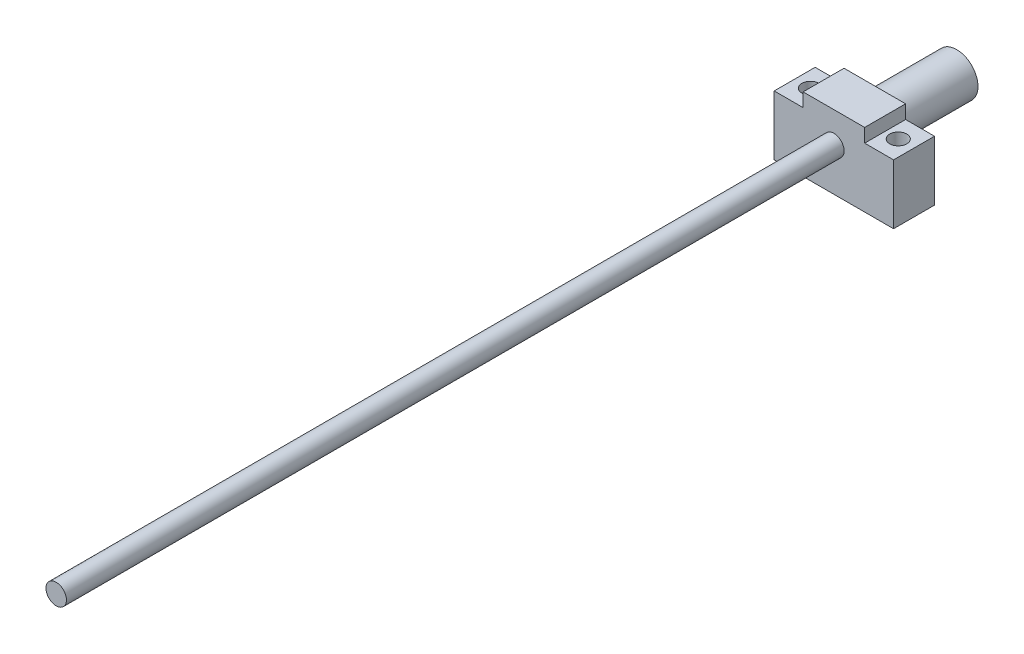
ISO-10303-21;
HEADER;
FILE_DESCRIPTION(('STEP AP214'),'2;1');
FILE_NAME('part.step','',(''),(''),'','','');
FILE_SCHEMA(('AUTOMOTIVE_DESIGN { 1 0 10303 214 1 1 1 1 }'));
ENDSEC;
DATA;
#1=APPLICATION_CONTEXT('core data for automotive mechanical design processes');
#2=APPLICATION_PROTOCOL_DEFINITION('international standard','automotive_design',2000,#1);
#3=PRODUCT_CONTEXT('',#1,'mechanical');
#4=PRODUCT('Part','Part','',(#3));
#5=PRODUCT_RELATED_PRODUCT_CATEGORY('part','',(#4));
#6=PRODUCT_DEFINITION_FORMATION('','',#4);
#7=PRODUCT_DEFINITION_CONTEXT('part definition',#1,'design');
#8=PRODUCT_DEFINITION('design','',#6,#7);
#9=PRODUCT_DEFINITION_SHAPE('','',#8);
#10=(LENGTH_UNIT() NAMED_UNIT(*) SI_UNIT(.MILLI.,.METRE.));
#11=(NAMED_UNIT(*) PLANE_ANGLE_UNIT() SI_UNIT($,.RADIAN.));
#12=(NAMED_UNIT(*) SI_UNIT($,.STERADIAN.) SOLID_ANGLE_UNIT());
#13=UNCERTAINTY_MEASURE_WITH_UNIT(LENGTH_MEASURE(1.E-05),#10,'distance_accuracy_value','');
#14=(GEOMETRIC_REPRESENTATION_CONTEXT(3) GLOBAL_UNCERTAINTY_ASSIGNED_CONTEXT((#13)) GLOBAL_UNIT_ASSIGNED_CONTEXT((#10,
#11,#12)) REPRESENTATION_CONTEXT('',''));
#15=CARTESIAN_POINT('',(0.,0.,0.));
#16=DIRECTION('',(0.,0.,1.));
#17=DIRECTION('',(1.,0.,0.));
#18=AXIS2_PLACEMENT_3D('',#15,#16,#17);
#19=CARTESIAN_POINT('',(18.05,0.,24.));
#20=DIRECTION('',(-1.,0.,0.));
#21=DIRECTION('',(0.,-1.,0.));
#22=AXIS2_PLACEMENT_3D('',#19,#20,#21);
#23=PLANE('',#22);
#24=DIRECTION('',(0.,1.,0.));
#25=VECTOR('',#24,1.);
#26=CARTESIAN_POINT('',(18.05,0.,0.));
#27=LINE('',#26,#25);
#28=CARTESIAN_POINT('',(18.05,17.5,0.));
#29=VERTEX_POINT('',#28);
#30=CARTESIAN_POINT('',(18.05,25.5,0.));
#31=VERTEX_POINT('',#30);
#32=EDGE_CURVE('E143',#29,#31,#27,.T.);
#33=ORIENTED_EDGE('',*,*,#32,.T.);
#34=DIRECTION('',(0.,0.,-1.));
#35=VECTOR('',#34,1.);
#36=CARTESIAN_POINT('',(18.05,25.5,24.));
#37=LINE('',#36,#35);
#38=CARTESIAN_POINT('',(18.05,25.5,24.));
#39=VERTEX_POINT('',#38);
#40=EDGE_CURVE('E11',#39,#31,#37,.T.);
#41=ORIENTED_EDGE('',*,*,#40,.F.);
#42=DIRECTION('',(0.,1.,0.));
#43=VECTOR('',#42,1.);
#44=CARTESIAN_POINT('',(18.05,0.,24.));
#45=LINE('',#44,#43);
#46=CARTESIAN_POINT('',(18.05,17.5,24.));
#47=VERTEX_POINT('',#46);
#48=EDGE_CURVE('E190',#47,#39,#45,.T.);
#49=ORIENTED_EDGE('',*,*,#48,.F.);
#50=DIRECTION('',(0.,0.,-1.));
#51=VECTOR('',#50,1.);
#52=CARTESIAN_POINT('',(18.05,17.5,24.));
#53=LINE('',#52,#51);
#54=EDGE_CURVE('E139',#47,#29,#53,.T.);
#55=ORIENTED_EDGE('',*,*,#54,.T.);
#56=EDGE_LOOP('',(#33,#41,#49,#55));
#57=FACE_BOUND('',#56,.T.);
#58=ADVANCED_FACE('F47',(#57),#23,.F.);
#59=CARTESIAN_POINT('',(0.,25.5,24.));
#60=DIRECTION('',(0.,-1.,0.));
#61=DIRECTION('',(0.,0.,-1.));
#62=AXIS2_PLACEMENT_3D('',#59,#60,#61);
#63=PLANE('',#62);
#64=DIRECTION('',(-1.,0.,0.));
#65=VECTOR('',#64,1.);
#66=CARTESIAN_POINT('',(0.,25.5,0.));
#67=LINE('',#66,#65);
#68=CARTESIAN_POINT('',(-18.05,25.5,0.));
#69=VERTEX_POINT('',#68);
#70=EDGE_CURVE('E146',#31,#69,#67,.T.);
#71=ORIENTED_EDGE('',*,*,#70,.T.);
#72=DIRECTION('',(0.,0.,-1.));
#73=VECTOR('',#72,1.);
#74=CARTESIAN_POINT('',(-18.05,25.5,24.));
#75=LINE('',#74,#73);
#76=CARTESIAN_POINT('',(-18.05,25.5,24.));
#77=VERTEX_POINT('',#76);
#78=EDGE_CURVE('E55',#77,#69,#75,.T.);
#79=ORIENTED_EDGE('',*,*,#78,.F.);
#80=DIRECTION('',(-1.,0.,0.));
#81=VECTOR('',#80,1.);
#82=CARTESIAN_POINT('',(0.,25.5,24.));
#83=LINE('',#82,#81);
#84=EDGE_CURVE('E106',#39,#77,#83,.T.);
#85=ORIENTED_EDGE('',*,*,#84,.F.);
#86=ORIENTED_EDGE('',*,*,#40,.T.);
#87=EDGE_LOOP('',(#71,#79,#85,#86));
#88=FACE_BOUND('',#87,.T.);
#89=ADVANCED_FACE('F259',(#88),#63,.F.);
#90=CARTESIAN_POINT('',(-18.05,0.,24.));
#91=DIRECTION('',(1.,0.,0.));
#92=DIRECTION('',(0.,0.,-1.));
#93=AXIS2_PLACEMENT_3D('',#90,#91,#92);
#94=PLANE('',#93);
#95=DIRECTION('',(0.,-1.,0.));
#96=VECTOR('',#95,1.);
#97=CARTESIAN_POINT('',(-18.05,0.,0.));
#98=LINE('',#97,#96);
#99=CARTESIAN_POINT('',(-18.05,17.5,0.));
#100=VERTEX_POINT('',#99);
#101=EDGE_CURVE('E149',#69,#100,#98,.T.);
#102=ORIENTED_EDGE('',*,*,#101,.T.);
#103=DIRECTION('',(0.,0.,-1.));
#104=VECTOR('',#103,1.);
#105=CARTESIAN_POINT('',(-18.05,17.5,24.));
#106=LINE('',#105,#104);
#107=CARTESIAN_POINT('',(-18.05,17.5,24.));
#108=VERTEX_POINT('',#107);
#109=EDGE_CURVE('E165',#108,#100,#106,.T.);
#110=ORIENTED_EDGE('',*,*,#109,.F.);
#111=DIRECTION('',(0.,-1.,0.));
#112=VECTOR('',#111,1.);
#113=CARTESIAN_POINT('',(-18.05,0.,24.));
#114=LINE('',#113,#112);
#115=EDGE_CURVE('E173',#77,#108,#114,.T.);
#116=ORIENTED_EDGE('',*,*,#115,.F.);
#117=ORIENTED_EDGE('',*,*,#78,.T.);
#118=EDGE_LOOP('',(#102,#110,#116,#117));
#119=FACE_BOUND('',#118,.T.);
#120=ADVANCED_FACE('F171',(#119),#94,.F.);
#121=CARTESIAN_POINT('',(0.,17.5,24.));
#122=DIRECTION('',(0.,-1.,0.));
#123=DIRECTION('',(0.,0.,-1.));
#124=AXIS2_PLACEMENT_3D('',#121,#122,#123);
#125=PLANE('',#124);
#126=CARTESIAN_POINT('',(-25.75,17.5000000000001,12.));
#127=DIRECTION('',(0.,1.,0.));
#128=DIRECTION('',(0.,0.,1.));
#129=AXIS2_PLACEMENT_3D('',#126,#127,#128);
#130=CIRCLE('',#129,4.99999999999999);
#131=CARTESIAN_POINT('',(-25.75,17.5000000000001,17.));
#132=VERTEX_POINT('',#131);
#133=EDGE_CURVE('E211',#132,#132,#130,.T.);
#134=ORIENTED_EDGE('',*,*,#133,.F.);
#135=EDGE_LOOP('',(#134));
#136=FACE_BOUND('',#135,.T.);
#137=DIRECTION('',(-1.,0.,0.));
#138=VECTOR('',#137,1.);
#139=CARTESIAN_POINT('',(0.,17.5,0.));
#140=LINE('',#139,#138);
#141=CARTESIAN_POINT('',(-35.,17.5,0.));
#142=VERTEX_POINT('',#141);
#143=EDGE_CURVE('E151',#100,#142,#140,.T.);
#144=ORIENTED_EDGE('',*,*,#143,.T.);
#145=DIRECTION('',(0.,0.,-1.));
#146=VECTOR('',#145,1.);
#147=CARTESIAN_POINT('',(-35.,17.5,24.));
#148=LINE('',#147,#146);
#149=CARTESIAN_POINT('',(-35.,17.5,24.));
#150=VERTEX_POINT('',#149);
#151=EDGE_CURVE('E162',#150,#142,#148,.T.);
#152=ORIENTED_EDGE('',*,*,#151,.F.);
#153=DIRECTION('',(-1.,0.,0.));
#154=VECTOR('',#153,1.);
#155=CARTESIAN_POINT('',(0.,17.5,24.));
#156=LINE('',#155,#154);
#157=EDGE_CURVE('E185',#108,#150,#156,.T.);
#158=ORIENTED_EDGE('',*,*,#157,.F.);
#159=ORIENTED_EDGE('',*,*,#109,.T.);
#160=EDGE_LOOP('',(#144,#152,#158,#159));
#161=FACE_BOUND('',#160,.T.);
#162=ADVANCED_FACE('F181',(#136,#161),#125,.F.);
#163=CARTESIAN_POINT('',(-35.,0.,24.));
#164=DIRECTION('',(1.,0.,0.));
#165=DIRECTION('',(0.,0.,-1.));
#166=AXIS2_PLACEMENT_3D('',#163,#164,#165);
#167=PLANE('',#166);
#168=DIRECTION('',(0.,-1.,0.));
#169=VECTOR('',#168,1.);
#170=CARTESIAN_POINT('',(-35.,0.,0.));
#171=LINE('',#170,#169);
#172=CARTESIAN_POINT('',(-35.,-17.5,0.));
#173=VERTEX_POINT('',#172);
#174=EDGE_CURVE('E153',#142,#173,#171,.T.);
#175=ORIENTED_EDGE('',*,*,#174,.T.);
#176=DIRECTION('',(0.,0.,-1.));
#177=VECTOR('',#176,1.);
#178=CARTESIAN_POINT('',(-35.,-17.5,24.));
#179=LINE('',#178,#177);
#180=CARTESIAN_POINT('',(-35.,-17.5,24.));
#181=VERTEX_POINT('',#180);
#182=EDGE_CURVE('E134',#181,#173,#179,.T.);
#183=ORIENTED_EDGE('',*,*,#182,.F.);
#184=DIRECTION('',(0.,-1.,0.));
#185=VECTOR('',#184,1.);
#186=CARTESIAN_POINT('',(-35.,0.,24.));
#187=LINE('',#186,#185);
#188=EDGE_CURVE('E125',#150,#181,#187,.T.);
#189=ORIENTED_EDGE('',*,*,#188,.F.);
#190=ORIENTED_EDGE('',*,*,#151,.T.);
#191=EDGE_LOOP('',(#175,#183,#189,#190));
#192=FACE_BOUND('',#191,.T.);
#193=ADVANCED_FACE('F184',(#192),#167,.F.);
#194=CARTESIAN_POINT('',(0.,-17.5,24.));
#195=DIRECTION('',(0.,1.,0.));
#196=DIRECTION('',(0.,0.,1.));
#197=AXIS2_PLACEMENT_3D('',#194,#195,#196);
#198=PLANE('',#197);
#199=CARTESIAN_POINT('',(-25.75,-17.5,12.));
#200=DIRECTION('',(0.,1.,0.));
#201=DIRECTION('',(0.,0.,1.));
#202=AXIS2_PLACEMENT_3D('',#199,#200,#201);
#203=CIRCLE('',#202,4.99999999999999);
#204=CARTESIAN_POINT('',(-25.75,-17.5,17.));
#205=VERTEX_POINT('',#204);
#206=EDGE_CURVE('E208',#205,#205,#203,.T.);
#207=ORIENTED_EDGE('',*,*,#206,.T.);
#208=EDGE_LOOP('',(#207));
#209=FACE_BOUND('',#208,.T.);
#210=CARTESIAN_POINT('',(25.75,-17.5000000000001,12.));
#211=DIRECTION('',(0.,1.,0.));
#212=DIRECTION('',(0.,0.,1.));
#213=AXIS2_PLACEMENT_3D('',#210,#211,#212);
#214=CIRCLE('',#213,4.99999999999999);
#215=CARTESIAN_POINT('',(25.75,-17.5000000000001,17.));
#216=VERTEX_POINT('',#215);
#217=EDGE_CURVE('E200',#216,#216,#214,.T.);
#218=ORIENTED_EDGE('',*,*,#217,.T.);
#219=EDGE_LOOP('',(#218));
#220=FACE_BOUND('',#219,.T.);
#221=DIRECTION('',(1.,0.,0.));
#222=VECTOR('',#221,1.);
#223=CARTESIAN_POINT('',(0.,-17.5,0.));
#224=LINE('',#223,#222);
#225=CARTESIAN_POINT('',(35.,-17.5,0.));
#226=VERTEX_POINT('',#225);
#227=EDGE_CURVE('E133',#173,#226,#224,.T.);
#228=ORIENTED_EDGE('',*,*,#227,.T.);
#229=DIRECTION('',(0.,0.,-1.));
#230=VECTOR('',#229,1.);
#231=CARTESIAN_POINT('',(35.,-17.5,24.));
#232=LINE('',#231,#230);
#233=CARTESIAN_POINT('',(35.,-17.5,24.));
#234=VERTEX_POINT('',#233);
#235=EDGE_CURVE('E130',#234,#226,#232,.T.);
#236=ORIENTED_EDGE('',*,*,#235,.F.);
#237=DIRECTION('',(1.,0.,0.));
#238=VECTOR('',#237,1.);
#239=CARTESIAN_POINT('',(0.,-17.5,24.));
#240=LINE('',#239,#238);
#241=EDGE_CURVE('E119',#181,#234,#240,.T.);
#242=ORIENTED_EDGE('',*,*,#241,.F.);
#243=ORIENTED_EDGE('',*,*,#182,.T.);
#244=EDGE_LOOP('',(#228,#236,#242,#243));
#245=FACE_BOUND('',#244,.T.);
#246=ADVANCED_FACE('F131',(#209,#220,#245),#198,.F.);
#247=CARTESIAN_POINT('',(35.,0.,24.));
#248=DIRECTION('',(-1.,0.,0.));
#249=DIRECTION('',(0.,0.,1.));
#250=AXIS2_PLACEMENT_3D('',#247,#248,#249);
#251=PLANE('',#250);
#252=DIRECTION('',(0.,1.,0.));
#253=VECTOR('',#252,1.);
#254=CARTESIAN_POINT('',(35.,0.,0.));
#255=LINE('',#254,#253);
#256=CARTESIAN_POINT('',(35.,17.5,0.));
#257=VERTEX_POINT('',#256);
#258=EDGE_CURVE('E92',#226,#257,#255,.T.);
#259=ORIENTED_EDGE('',*,*,#258,.T.);
#260=DIRECTION('',(0.,0.,-1.));
#261=VECTOR('',#260,1.);
#262=CARTESIAN_POINT('',(35.,17.5,24.));
#263=LINE('',#262,#261);
#264=CARTESIAN_POINT('',(35.,17.5,24.));
#265=VERTEX_POINT('',#264);
#266=EDGE_CURVE('E135',#265,#257,#263,.T.);
#267=ORIENTED_EDGE('',*,*,#266,.F.);
#268=DIRECTION('',(0.,1.,0.));
#269=VECTOR('',#268,1.);
#270=CARTESIAN_POINT('',(35.,0.,24.));
#271=LINE('',#270,#269);
#272=EDGE_CURVE('E123',#234,#265,#271,.T.);
#273=ORIENTED_EDGE('',*,*,#272,.F.);
#274=ORIENTED_EDGE('',*,*,#235,.T.);
#275=EDGE_LOOP('',(#259,#267,#273,#274));
#276=FACE_BOUND('',#275,.T.);
#277=ADVANCED_FACE('F137',(#276),#251,.F.);
#278=CARTESIAN_POINT('',(0.,17.5,24.));
#279=DIRECTION('',(0.,-1.,0.));
#280=DIRECTION('',(0.,0.,-1.));
#281=AXIS2_PLACEMENT_3D('',#278,#279,#280);
#282=PLANE('',#281);
#283=CARTESIAN_POINT('',(25.75,17.5,12.));
#284=DIRECTION('',(0.,1.,0.));
#285=DIRECTION('',(0.,0.,1.));
#286=AXIS2_PLACEMENT_3D('',#283,#284,#285);
#287=CIRCLE('',#286,4.99999999999999);
#288=CARTESIAN_POINT('',(25.75,17.5,17.));
#289=VERTEX_POINT('',#288);
#290=EDGE_CURVE('E205',#289,#289,#287,.T.);
#291=ORIENTED_EDGE('',*,*,#290,.F.);
#292=EDGE_LOOP('',(#291));
#293=FACE_BOUND('',#292,.T.);
#294=DIRECTION('',(-1.,0.,0.));
#295=VECTOR('',#294,1.);
#296=CARTESIAN_POINT('',(0.,17.5,0.));
#297=LINE('',#296,#295);
#298=EDGE_CURVE('E98',#257,#29,#297,.T.);
#299=ORIENTED_EDGE('',*,*,#298,.T.);
#300=ORIENTED_EDGE('',*,*,#54,.F.);
#301=DIRECTION('',(-1.,0.,0.));
#302=VECTOR('',#301,1.);
#303=CARTESIAN_POINT('',(0.,17.5,24.));
#304=LINE('',#303,#302);
#305=EDGE_CURVE('E63',#265,#47,#304,.T.);
#306=ORIENTED_EDGE('',*,*,#305,.F.);
#307=ORIENTED_EDGE('',*,*,#266,.T.);
#308=EDGE_LOOP('',(#299,#300,#306,#307));
#309=FACE_BOUND('',#308,.T.);
#310=ADVANCED_FACE('F254',(#293,#309),#282,.F.);
#311=CARTESIAN_POINT('',(0.,0.,24.));
#312=DIRECTION('',(0.,0.,1.));
#313=DIRECTION('',(1.,0.,0.));
#314=AXIS2_PLACEMENT_3D('',#311,#312,#313);
#315=PLANE('',#314);
#316=CARTESIAN_POINT('',(0.,7.50000000000001,24.));
#317=DIRECTION('',(0.,0.,1.));
#318=DIRECTION('',(1.,0.,0.));
#319=AXIS2_PLACEMENT_3D('',#316,#317,#318);
#320=CIRCLE('',#319,6.);
#321=CARTESIAN_POINT('',(6.,7.50000000000001,24.));
#322=VERTEX_POINT('',#321);
#323=EDGE_CURVE('E158',#322,#322,#320,.T.);
#324=ORIENTED_EDGE('',*,*,#323,.F.);
#325=EDGE_LOOP('',(#324));
#326=FACE_BOUND('',#325,.T.);
#327=ORIENTED_EDGE('',*,*,#48,.T.);
#328=ORIENTED_EDGE('',*,*,#84,.T.);
#329=ORIENTED_EDGE('',*,*,#115,.T.);
#330=ORIENTED_EDGE('',*,*,#157,.T.);
#331=ORIENTED_EDGE('',*,*,#188,.T.);
#332=ORIENTED_EDGE('',*,*,#241,.T.);
#333=ORIENTED_EDGE('',*,*,#272,.T.);
#334=ORIENTED_EDGE('',*,*,#305,.T.);
#335=EDGE_LOOP('',(#327,#328,#329,#330,#331,#332,#333,#334));
#336=FACE_BOUND('',#335,.T.);
#337=ADVANCED_FACE('F121',(#326,#336),#315,.T.);
#338=CARTESIAN_POINT('',(0.,0.,0.));
#339=DIRECTION('',(0.,0.,1.));
#340=DIRECTION('',(1.,0.,0.));
#341=AXIS2_PLACEMENT_3D('',#338,#339,#340);
#342=PLANE('',#341);
#343=CARTESIAN_POINT('',(0.,7.50000000000001,0.));
#344=DIRECTION('',(0.,0.,1.));
#345=DIRECTION('',(1.,0.,0.));
#346=AXIS2_PLACEMENT_3D('',#343,#344,#345);
#347=CIRCLE('',#346,12.5);
#348=CARTESIAN_POINT('',(12.5,7.50000000000001,0.));
#349=VERTEX_POINT('',#348);
#350=EDGE_CURVE('E197',#349,#349,#347,.T.);
#351=ORIENTED_EDGE('',*,*,#350,.T.);
#352=EDGE_LOOP('',(#351));
#353=FACE_BOUND('',#352,.T.);
#354=ORIENTED_EDGE('',*,*,#32,.F.);
#355=ORIENTED_EDGE('',*,*,#298,.F.);
#356=ORIENTED_EDGE('',*,*,#258,.F.);
#357=ORIENTED_EDGE('',*,*,#227,.F.);
#358=ORIENTED_EDGE('',*,*,#174,.F.);
#359=ORIENTED_EDGE('',*,*,#143,.F.);
#360=ORIENTED_EDGE('',*,*,#101,.F.);
#361=ORIENTED_EDGE('',*,*,#70,.F.);
#362=EDGE_LOOP('',(#354,#355,#356,#357,#358,#359,#360,#361));
#363=FACE_BOUND('',#362,.T.);
#364=ADVANCED_FACE('F177',(#353,#363),#342,.F.);
#365=CARTESIAN_POINT('',(0.,7.50000000000001,480.));
#366=DIRECTION('',(0.,0.,-1.));
#367=DIRECTION('',(-1.,0.,0.));
#368=AXIS2_PLACEMENT_3D('',#365,#366,#367);
#369=CYLINDRICAL_SURFACE('',#368,6.);
#370=ORIENTED_EDGE('',*,*,#323,.T.);
#371=EDGE_LOOP('',(#370));
#372=FACE_BOUND('',#371,.T.);
#373=CARTESIAN_POINT('',(0.,7.50000000000001,480.));
#374=DIRECTION('',(0.,0.,1.));
#375=DIRECTION('',(1.,0.,0.));
#376=AXIS2_PLACEMENT_3D('',#373,#374,#375);
#377=CIRCLE('',#376,6.);
#378=CARTESIAN_POINT('',(6.,7.50000000000001,480.));
#379=VERTEX_POINT('',#378);
#380=EDGE_CURVE('E147',#379,#379,#377,.T.);
#381=ORIENTED_EDGE('',*,*,#380,.F.);
#382=EDGE_LOOP('',(#381));
#383=FACE_BOUND('',#382,.T.);
#384=ADVANCED_FACE('F245',(#372,#383),#369,.T.);
#385=CARTESIAN_POINT('',(0.,0.,480.));
#386=DIRECTION('',(0.,0.,1.));
#387=DIRECTION('',(1.,0.,0.));
#388=AXIS2_PLACEMENT_3D('',#385,#386,#387);
#389=PLANE('',#388);
#390=ORIENTED_EDGE('',*,*,#380,.T.);
#391=EDGE_LOOP('',(#390));
#392=FACE_BOUND('',#391,.T.);
#393=ADVANCED_FACE('F240',(#392),#389,.T.);
#394=CARTESIAN_POINT('',(0.,7.50000000000001,-48.));
#395=DIRECTION('',(0.,0.,1.));
#396=DIRECTION('',(1.,0.,0.));
#397=AXIS2_PLACEMENT_3D('',#394,#395,#396);
#398=CYLINDRICAL_SURFACE('',#397,12.5);
#399=CARTESIAN_POINT('',(0.,7.50000000000001,-48.));
#400=DIRECTION('',(0.,0.,1.));
#401=DIRECTION('',(1.,0.,0.));
#402=AXIS2_PLACEMENT_3D('',#399,#400,#401);
#403=CIRCLE('',#402,12.5);
#404=CARTESIAN_POINT('',(12.5,7.50000000000001,-48.));
#405=VERTEX_POINT('',#404);
#406=EDGE_CURVE('E196',#405,#405,#403,.T.);
#407=ORIENTED_EDGE('',*,*,#406,.T.);
#408=EDGE_LOOP('',(#407));
#409=FACE_BOUND('',#408,.T.);
#410=ORIENTED_EDGE('',*,*,#350,.F.);
#411=EDGE_LOOP('',(#410));
#412=FACE_BOUND('',#411,.T.);
#413=ADVANCED_FACE('F234',(#409,#412),#398,.T.);
#414=CARTESIAN_POINT('',(0.,7.50000000000001,-48.));
#415=DIRECTION('',(0.,0.,1.));
#416=DIRECTION('',(1.,0.,0.));
#417=AXIS2_PLACEMENT_3D('',#414,#415,#416);
#418=PLANE('',#417);
#419=CARTESIAN_POINT('',(0.,7.50000000000001,-48.));
#420=DIRECTION('',(0.,0.,-1.));
#421=DIRECTION('',(-1.,0.,0.));
#422=AXIS2_PLACEMENT_3D('',#419,#420,#421);
#423=CIRCLE('',#422,4.);
#424=CARTESIAN_POINT('',(-4.,7.50000000000001,-48.));
#425=VERTEX_POINT('',#424);
#426=EDGE_CURVE('E215',#425,#425,#423,.T.);
#427=ORIENTED_EDGE('',*,*,#426,.F.);
#428=EDGE_LOOP('',(#427));
#429=FACE_BOUND('',#428,.T.);
#430=ORIENTED_EDGE('',*,*,#406,.F.);
#431=EDGE_LOOP('',(#430));
#432=FACE_BOUND('',#431,.T.);
#433=ADVANCED_FACE('F230',(#429,#432),#418,.F.);
#434=CARTESIAN_POINT('',(25.75,17.5,12.));
#435=DIRECTION('',(0.,1.,0.));
#436=DIRECTION('',(0.,0.,1.));
#437=AXIS2_PLACEMENT_3D('',#434,#435,#436);
#438=CYLINDRICAL_SURFACE('',#437,4.99999999999999);
#439=ORIENTED_EDGE('',*,*,#217,.F.);
#440=EDGE_LOOP('',(#439));
#441=FACE_BOUND('',#440,.T.);
#442=ORIENTED_EDGE('',*,*,#290,.T.);
#443=EDGE_LOOP('',(#442));
#444=FACE_BOUND('',#443,.T.);
#445=ADVANCED_FACE('F233',(#441,#444),#438,.F.);
#446=CARTESIAN_POINT('',(-25.75,17.5000000000001,12.));
#447=DIRECTION('',(0.,1.,0.));
#448=DIRECTION('',(0.,0.,1.));
#449=AXIS2_PLACEMENT_3D('',#446,#447,#448);
#450=CYLINDRICAL_SURFACE('',#449,4.99999999999999);
#451=ORIENTED_EDGE('',*,*,#206,.F.);
#452=EDGE_LOOP('',(#451));
#453=FACE_BOUND('',#452,.T.);
#454=ORIENTED_EDGE('',*,*,#133,.T.);
#455=EDGE_LOOP('',(#454));
#456=FACE_BOUND('',#455,.T.);
#457=ADVANCED_FACE('F226',(#453,#456),#450,.F.);
#458=CARTESIAN_POINT('',(0.,7.50000000000001,-18.));
#459=DIRECTION('',(0.,0.,-1.));
#460=DIRECTION('',(-1.,0.,0.));
#461=AXIS2_PLACEMENT_3D('',#458,#459,#460);
#462=CYLINDRICAL_SURFACE('',#461,4.);
#463=CARTESIAN_POINT('',(0.,7.50000000000001,-18.));
#464=DIRECTION('',(0.,0.,-1.));
#465=DIRECTION('',(-1.,0.,0.));
#466=AXIS2_PLACEMENT_3D('',#463,#464,#465);
#467=CIRCLE('',#466,4.);
#468=CARTESIAN_POINT('',(-4.,7.50000000000001,-18.));
#469=VERTEX_POINT('',#468);
#470=EDGE_CURVE('E214',#469,#469,#467,.T.);
#471=ORIENTED_EDGE('',*,*,#470,.F.);
#472=EDGE_LOOP('',(#471));
#473=FACE_BOUND('',#472,.T.);
#474=ORIENTED_EDGE('',*,*,#426,.T.);
#475=EDGE_LOOP('',(#474));
#476=FACE_BOUND('',#475,.T.);
#477=ADVANCED_FACE('F223',(#473,#476),#462,.F.);
#478=CARTESIAN_POINT('',(0.,7.50000000000001,-18.));
#479=DIRECTION('',(0.,0.,-1.));
#480=DIRECTION('',(-1.,0.,0.));
#481=AXIS2_PLACEMENT_3D('',#478,#479,#480);
#482=PLANE('',#481);
#483=ORIENTED_EDGE('',*,*,#470,.T.);
#484=EDGE_LOOP('',(#483));
#485=FACE_BOUND('',#484,.T.);
#486=ADVANCED_FACE('F221',(#485),#482,.T.);
#487=CLOSED_SHELL('',(#58,#89,#120,#162,#193,#246,#277,#310,#337,#364,#384,#393,#413,#433,#445,
#457,#477,#486));
#488=MANIFOLD_SOLID_BREP('B2',#487);
#489=ADVANCED_BREP_SHAPE_REPRESENTATION('',(#18,#488),#14);
#490=SHAPE_DEFINITION_REPRESENTATION(#9,#489);
ENDSEC;
END-ISO-10303-21;
